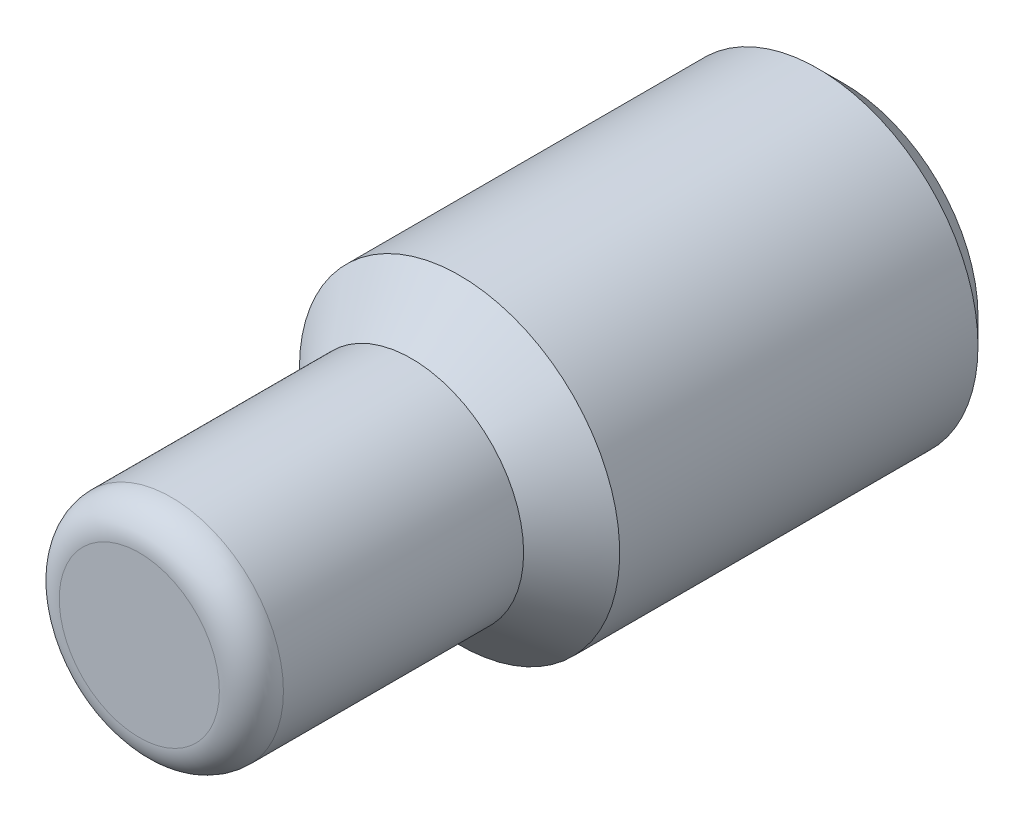
ISO-10303-21;
HEADER;
FILE_DESCRIPTION(('STEP AP214'),'2;1');
FILE_NAME('part.step','',(''),(''),'','','');
FILE_SCHEMA(('AUTOMOTIVE_DESIGN { 1 0 10303 214 1 1 1 1 }'));
ENDSEC;
DATA;
#1=APPLICATION_CONTEXT('core data for automotive mechanical design processes');
#2=APPLICATION_PROTOCOL_DEFINITION('international standard','automotive_design',2000,#1);
#3=PRODUCT_CONTEXT('',#1,'mechanical');
#4=PRODUCT('Part','Part','',(#3));
#5=PRODUCT_RELATED_PRODUCT_CATEGORY('part','',(#4));
#6=PRODUCT_DEFINITION_FORMATION('','',#4);
#7=PRODUCT_DEFINITION_CONTEXT('part definition',#1,'design');
#8=PRODUCT_DEFINITION('design','',#6,#7);
#9=PRODUCT_DEFINITION_SHAPE('','',#8);
#10=(LENGTH_UNIT() NAMED_UNIT(*) SI_UNIT(.MILLI.,.METRE.));
#11=(NAMED_UNIT(*) PLANE_ANGLE_UNIT() SI_UNIT($,.RADIAN.));
#12=(NAMED_UNIT(*) SI_UNIT($,.STERADIAN.) SOLID_ANGLE_UNIT());
#13=UNCERTAINTY_MEASURE_WITH_UNIT(LENGTH_MEASURE(1.E-05),#10,'distance_accuracy_value','');
#14=(GEOMETRIC_REPRESENTATION_CONTEXT(3) GLOBAL_UNCERTAINTY_ASSIGNED_CONTEXT((#13)) GLOBAL_UNIT_ASSIGNED_CONTEXT((#10,
#11,#12)) REPRESENTATION_CONTEXT('',''));
#15=CARTESIAN_POINT('',(0.,0.,0.));
#16=DIRECTION('',(0.,0.,1.));
#17=DIRECTION('',(1.,0.,0.));
#18=AXIS2_PLACEMENT_3D('',#15,#16,#17);
#19=CARTESIAN_POINT('',(0.,0.,22.));
#20=DIRECTION('',(0.,0.,-1.));
#21=DIRECTION('',(-1.,0.,0.));
#22=AXIS2_PLACEMENT_3D('',#19,#20,#21);
#23=CYLINDRICAL_SURFACE('',#22,3.5);
#24=CARTESIAN_POINT('',(0.,0.,13.5));
#25=DIRECTION('',(0.,0.,-1.));
#26=DIRECTION('',(-1.,0.,0.));
#27=AXIS2_PLACEMENT_3D('',#24,#25,#26);
#28=CIRCLE('',#27,3.5);
#29=CARTESIAN_POINT('',(-3.5,0.,13.5));
#30=VERTEX_POINT('',#29);
#31=EDGE_CURVE('E10',#30,#30,#28,.F.);
#32=ORIENTED_EDGE('',*,*,#31,.T.);
#33=EDGE_LOOP('',(#32));
#34=FACE_BOUND('',#33,.T.);
#35=CARTESIAN_POINT('',(0.,0.,21.));
#36=DIRECTION('',(0.,0.,1.));
#37=DIRECTION('',(1.,0.,0.));
#38=AXIS2_PLACEMENT_3D('',#35,#36,#37);
#39=CIRCLE('',#38,3.5);
#40=CARTESIAN_POINT('',(3.5,0.,21.));
#41=VERTEX_POINT('',#40);
#42=EDGE_CURVE('E61',#41,#41,#39,.F.);
#43=ORIENTED_EDGE('',*,*,#42,.T.);
#44=EDGE_LOOP('',(#43));
#45=FACE_BOUND('',#44,.T.);
#46=ADVANCED_FACE('F47',(#34,#45),#23,.T.);
#47=CARTESIAN_POINT('',(0.,0.,22.));
#48=DIRECTION('',(0.,0.,1.));
#49=DIRECTION('',(1.,0.,0.));
#50=AXIS2_PLACEMENT_3D('',#47,#48,#49);
#51=PLANE('',#50);
#52=CARTESIAN_POINT('',(0.,0.,22.));
#53=DIRECTION('',(0.,0.,1.));
#54=DIRECTION('',(1.,0.,0.));
#55=AXIS2_PLACEMENT_3D('',#52,#53,#54);
#56=CIRCLE('',#55,2.5);
#57=CARTESIAN_POINT('',(2.5,0.,22.));
#58=VERTEX_POINT('',#57);
#59=EDGE_CURVE('E66',#58,#58,#56,.T.);
#60=ORIENTED_EDGE('',*,*,#59,.T.);
#61=EDGE_LOOP('',(#60));
#62=FACE_BOUND('',#61,.T.);
#63=ADVANCED_FACE('F97',(#62),#51,.T.);
#64=CARTESIAN_POINT('',(0.,0.,21.));
#65=DIRECTION('',(0.,0.,1.));
#66=DIRECTION('',(1.,0.,0.));
#67=AXIS2_PLACEMENT_3D('',#64,#65,#66);
#68=TOROIDAL_SURFACE('',#67,2.5,1.);
#69=ORIENTED_EDGE('',*,*,#42,.F.);
#70=EDGE_LOOP('',(#69));
#71=FACE_BOUND('',#70,.T.);
#72=ORIENTED_EDGE('',*,*,#59,.F.);
#73=EDGE_LOOP('',(#72));
#74=FACE_BOUND('',#73,.T.);
#75=ADVANCED_FACE('F102',(#71,#74),#68,.T.);
#76=CARTESIAN_POINT('',(0.,0.,14.));
#77=DIRECTION('',(0.,0.,-1.));
#78=DIRECTION('',(-1.,0.,0.));
#79=AXIS2_PLACEMENT_3D('',#76,#77,#78);
#80=CYLINDRICAL_SURFACE('',#79,5.);
#81=CARTESIAN_POINT('',(0.,0.,12.));
#82=DIRECTION('',(0.,0.,-1.));
#83=DIRECTION('',(-1.,0.,0.));
#84=AXIS2_PLACEMENT_3D('',#81,#82,#83);
#85=CIRCLE('',#84,5.);
#86=CARTESIAN_POINT('',(-5.,0.,12.));
#87=VERTEX_POINT('',#86);
#88=EDGE_CURVE('E56',#87,#87,#85,.T.);
#89=ORIENTED_EDGE('',*,*,#88,.T.);
#90=EDGE_LOOP('',(#89));
#91=FACE_BOUND('',#90,.T.);
#92=CARTESIAN_POINT('',(0.,0.,0.811999999999986));
#93=DIRECTION('',(0.,0.,1.));
#94=DIRECTION('',(1.,0.,0.));
#95=AXIS2_PLACEMENT_3D('',#92,#93,#94);
#96=CIRCLE('',#95,5.);
#97=CARTESIAN_POINT('',(5.,0.,0.811999999999986));
#98=VERTEX_POINT('',#97);
#99=EDGE_CURVE('E72',#98,#98,#96,.T.);
#100=ORIENTED_EDGE('',*,*,#99,.T.);
#101=EDGE_LOOP('',(#100));
#102=FACE_BOUND('',#101,.T.);
#103=ADVANCED_FACE('F92',(#91,#102),#80,.T.);
#104=CARTESIAN_POINT('',(0.,0.,0.));
#105=DIRECTION('',(0.,0.,1.));
#106=DIRECTION('',(1.,0.,0.));
#107=AXIS2_PLACEMENT_3D('',#104,#105,#106);
#108=CONICAL_SURFACE('',#107,4.188,0.785398163397455);
#109=ORIENTED_EDGE('',*,*,#99,.F.);
#110=EDGE_LOOP('',(#109));
#111=FACE_BOUND('',#110,.T.);
#112=CARTESIAN_POINT('',(0.,0.,0.));
#113=DIRECTION('',(0.,0.,1.));
#114=DIRECTION('',(1.,0.,0.));
#115=AXIS2_PLACEMENT_3D('',#112,#113,#114);
#116=CIRCLE('',#115,4.188);
#117=CARTESIAN_POINT('',(4.188,0.,0.));
#118=VERTEX_POINT('',#117);
#119=EDGE_CURVE('E76',#118,#118,#116,.T.);
#120=ORIENTED_EDGE('',*,*,#119,.T.);
#121=EDGE_LOOP('',(#120));
#122=FACE_BOUND('',#121,.T.);
#123=ADVANCED_FACE('F81',(#111,#122),#108,.T.);
#124=CARTESIAN_POINT('',(0.,0.,0.));
#125=DIRECTION('',(0.,0.,1.));
#126=DIRECTION('',(1.,0.,0.));
#127=AXIS2_PLACEMENT_3D('',#124,#125,#126);
#128=PLANE('',#127);
#129=ORIENTED_EDGE('',*,*,#119,.F.);
#130=EDGE_LOOP('',(#129));
#131=FACE_BOUND('',#130,.T.);
#132=ADVANCED_FACE('F83',(#131),#128,.F.);
#133=CARTESIAN_POINT('',(0.,0.,12.));
#134=DIRECTION('',(0.,0.,-1.));
#135=DIRECTION('',(-1.,0.,0.));
#136=AXIS2_PLACEMENT_3D('',#133,#134,#135);
#137=CONICAL_SURFACE('',#136,5.,0.785398163397443);
#138=ORIENTED_EDGE('',*,*,#31,.F.);
#139=EDGE_LOOP('',(#138));
#140=FACE_BOUND('',#139,.T.);
#141=ORIENTED_EDGE('',*,*,#88,.F.);
#142=EDGE_LOOP('',(#141));
#143=FACE_BOUND('',#142,.T.);
#144=ADVANCED_FACE('F50',(#140,#143),#137,.T.);
#145=CLOSED_SHELL('',(#46,#63,#75,#103,#123,#132,#144));
#146=MANIFOLD_SOLID_BREP('B2',#145);
#147=ADVANCED_BREP_SHAPE_REPRESENTATION('',(#18,#146),#14);
#148=SHAPE_DEFINITION_REPRESENTATION(#9,#147);
ENDSEC;
END-ISO-10303-21;
